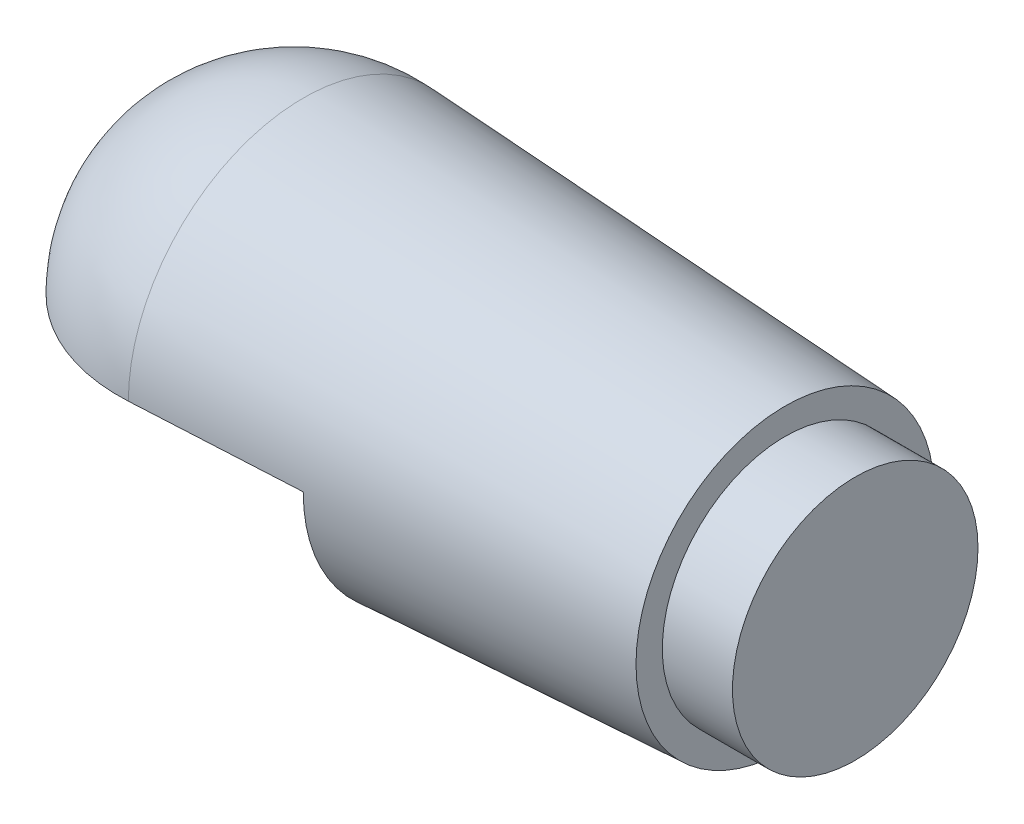
ISO-10303-21;
HEADER;
FILE_DESCRIPTION(('STEP AP214'),'2;1');
FILE_NAME('part.step','',(''),(''),'','','');
FILE_SCHEMA(('AUTOMOTIVE_DESIGN { 1 0 10303 214 1 1 1 1 }'));
ENDSEC;
DATA;
#1=APPLICATION_CONTEXT('core data for automotive mechanical design processes');
#2=APPLICATION_PROTOCOL_DEFINITION('international standard','automotive_design',2000,#1);
#3=PRODUCT_CONTEXT('',#1,'mechanical');
#4=PRODUCT('Part','Part','',(#3));
#5=PRODUCT_RELATED_PRODUCT_CATEGORY('part','',(#4));
#6=PRODUCT_DEFINITION_FORMATION('','',#4);
#7=PRODUCT_DEFINITION_CONTEXT('part definition',#1,'design');
#8=PRODUCT_DEFINITION('design','',#6,#7);
#9=PRODUCT_DEFINITION_SHAPE('','',#8);
#10=(LENGTH_UNIT() NAMED_UNIT(*) SI_UNIT(.MILLI.,.METRE.));
#11=(NAMED_UNIT(*) PLANE_ANGLE_UNIT() SI_UNIT($,.RADIAN.));
#12=(NAMED_UNIT(*) SI_UNIT($,.STERADIAN.) SOLID_ANGLE_UNIT());
#13=UNCERTAINTY_MEASURE_WITH_UNIT(LENGTH_MEASURE(1.E-05),#10,'distance_accuracy_value','');
#14=(GEOMETRIC_REPRESENTATION_CONTEXT(3) GLOBAL_UNCERTAINTY_ASSIGNED_CONTEXT((#13)) GLOBAL_UNIT_ASSIGNED_CONTEXT((#10,
#11,#12)) REPRESENTATION_CONTEXT('',''));
#15=CARTESIAN_POINT('',(0.,0.,0.));
#16=DIRECTION('',(0.,0.,1.));
#17=DIRECTION('',(1.,0.,0.));
#18=AXIS2_PLACEMENT_3D('',#15,#16,#17);
#19=CARTESIAN_POINT('',(0.,0.,0.));
#20=DIRECTION('',(-1.,0.,0.));
#21=DIRECTION('',(0.,0.,1.));
#22=AXIS2_PLACEMENT_3D('',#19,#20,#21);
#23=CONICAL_SURFACE('',#22,42.5,0.0540408983745297);
#24=CARTESIAN_POINT('',(0.,0.,0.));
#25=DIRECTION('',(-1.,0.,0.));
#26=DIRECTION('',(0.,0.,1.));
#27=AXIS2_PLACEMENT_3D('',#24,#25,#26);
#28=CIRCLE('',#27,42.5);
#29=CARTESIAN_POINT('',(0.,0.,42.5));
#30=VERTEX_POINT('',#29);
#31=EDGE_CURVE('E64',#30,#30,#28,.T.);
#32=ORIENTED_EDGE('',*,*,#31,.T.);
#33=EDGE_LOOP('',(#32));
#34=FACE_BOUND('',#33,.T.);
#35=DIRECTION('',(-0.998540145985401,0.,0.0540145985401461));
#36=VECTOR('',#35,1.);
#37=CARTESIAN_POINT('',(785.675675675674,0.,0.));
#38=LINE('',#37,#36);
#39=CARTESIAN_POINT('',(-90.,0.,47.3684210526316));
#40=VERTEX_POINT('',#39);
#41=CARTESIAN_POINT('',(-137.299270072993,0.,49.9270072992701));
#42=VERTEX_POINT('',#41);
#43=EDGE_CURVE('E53',#40,#42,#38,.T.);
#44=ORIENTED_EDGE('',*,*,#43,.F.);
#45=CARTESIAN_POINT('',(-90.,0.,0.));
#46=DIRECTION('',(1.,0.,0.));
#47=DIRECTION('',(0.,0.,-1.));
#48=AXIS2_PLACEMENT_3D('',#45,#46,#47);
#49=CIRCLE('',#48,47.3684210526316);
#50=CARTESIAN_POINT('',(-90.,0.,-47.3684210526316));
#51=VERTEX_POINT('',#50);
#52=EDGE_CURVE('E36',#40,#51,#49,.T.);
#53=ORIENTED_EDGE('',*,*,#52,.T.);
#54=DIRECTION('',(0.998540145985401,0.,0.0540145985401461));
#55=VECTOR('',#54,1.);
#56=CARTESIAN_POINT('',(785.675675675674,0.,0.));
#57=LINE('',#56,#55);
#58=CARTESIAN_POINT('',(-137.299270072993,0.,-49.9270072992701));
#59=VERTEX_POINT('',#58);
#60=EDGE_CURVE('E66',#59,#51,#57,.T.);
#61=ORIENTED_EDGE('',*,*,#60,.F.);
#62=CARTESIAN_POINT('',(-137.299270072993,0.,0.));
#63=DIRECTION('',(-1.,0.,0.));
#64=DIRECTION('',(0.,0.,1.));
#65=AXIS2_PLACEMENT_3D('',#62,#63,#64);
#66=CIRCLE('',#65,49.9270072992701);
#67=EDGE_CURVE('E72',#42,#59,#66,.T.);
#68=ORIENTED_EDGE('',*,*,#67,.F.);
#69=EDGE_LOOP('',(#44,#53,#61,#68));
#70=FACE_BOUND('',#69,.T.);
#71=ADVANCED_FACE('F32',(#34,#70),#23,.T.);
#72=CARTESIAN_POINT('',(-140.,0.,0.));
#73=DIRECTION('',(-1.,0.,0.));
#74=DIRECTION('',(0.,0.,-1.));
#75=AXIS2_PLACEMENT_3D('',#72,#73,#74);
#76=SPHERICAL_SURFACE('',#75,50.);
#77=ORIENTED_EDGE('',*,*,#67,.T.);
#78=CARTESIAN_POINT('',(-140.,0.,0.));
#79=DIRECTION('',(0.,-1.,0.));
#80=DIRECTION('',(0.,0.,-1.));
#81=AXIS2_PLACEMENT_3D('',#78,#79,#80);
#82=CIRCLE('',#81,50.);
#83=EDGE_CURVE('E48',#42,#59,#82,.T.);
#84=ORIENTED_EDGE('',*,*,#83,.F.);
#85=EDGE_LOOP('',(#77,#84));
#86=FACE_BOUND('',#85,.T.);
#87=ADVANCED_FACE('F97',(#86),#76,.T.);
#88=CARTESIAN_POINT('',(0.,0.,0.));
#89=DIRECTION('',(-1.,0.,0.));
#90=DIRECTION('',(0.,0.,1.));
#91=AXIS2_PLACEMENT_3D('',#88,#89,#90);
#92=PLANE('',#91);
#93=CARTESIAN_POINT('',(0.,0.,0.));
#94=DIRECTION('',(1.,0.,0.));
#95=DIRECTION('',(0.,0.,-1.));
#96=AXIS2_PLACEMENT_3D('',#93,#94,#95);
#97=CIRCLE('',#96,35.);
#98=CARTESIAN_POINT('',(0.,0.,-35.));
#99=VERTEX_POINT('',#98);
#100=EDGE_CURVE('E11',#99,#99,#97,.T.);
#101=ORIENTED_EDGE('',*,*,#100,.F.);
#102=EDGE_LOOP('',(#101));
#103=FACE_BOUND('',#102,.T.);
#104=ORIENTED_EDGE('',*,*,#31,.F.);
#105=EDGE_LOOP('',(#104));
#106=FACE_BOUND('',#105,.T.);
#107=ADVANCED_FACE('F34',(#103,#106),#92,.F.);
#108=CARTESIAN_POINT('',(-90.,-62.,50.));
#109=DIRECTION('',(1.,0.,0.));
#110=DIRECTION('',(0.,0.,-1.));
#111=AXIS2_PLACEMENT_3D('',#108,#109,#110);
#112=PLANE('',#111);
#113=DIRECTION('',(0.,0.,-1.));
#114=VECTOR('',#113,1.);
#115=CARTESIAN_POINT('',(-90.,0.,50.));
#116=LINE('',#115,#114);
#117=EDGE_CURVE('E62',#40,#51,#116,.T.);
#118=ORIENTED_EDGE('',*,*,#117,.T.);
#119=ORIENTED_EDGE('',*,*,#52,.F.);
#120=EDGE_LOOP('',(#118,#119));
#121=FACE_BOUND('',#120,.T.);
#122=ADVANCED_FACE('F61',(#121),#112,.F.);
#123=CARTESIAN_POINT('',(0.,0.,0.));
#124=DIRECTION('',(0.,-1.,0.));
#125=DIRECTION('',(0.,0.,-1.));
#126=AXIS2_PLACEMENT_3D('',#123,#124,#125);
#127=PLANE('',#126);
#128=CARTESIAN_POINT('',(-140.,0.,0.));
#129=DIRECTION('',(0.,-1.,0.));
#130=DIRECTION('',(0.,0.,-1.));
#131=AXIS2_PLACEMENT_3D('',#128,#129,#130);
#132=CIRCLE('',#131,35.);
#133=CARTESIAN_POINT('',(-140.,0.,-35.));
#134=VERTEX_POINT('',#133);
#135=EDGE_CURVE('E67',#134,#134,#132,.F.);
#136=ORIENTED_EDGE('',*,*,#135,.T.);
#137=EDGE_LOOP('',(#136));
#138=FACE_BOUND('',#137,.T.);
#139=ORIENTED_EDGE('',*,*,#43,.T.);
#140=ORIENTED_EDGE('',*,*,#83,.T.);
#141=ORIENTED_EDGE('',*,*,#60,.T.);
#142=ORIENTED_EDGE('',*,*,#117,.F.);
#143=EDGE_LOOP('',(#139,#140,#141,#142));
#144=FACE_BOUND('',#143,.T.);
#145=ADVANCED_FACE('F65',(#138,#144),#127,.T.);
#146=CARTESIAN_POINT('',(-140.,0.,0.));
#147=DIRECTION('',(-1.,0.,0.));
#148=DIRECTION('',(0.,0.,1.));
#149=AXIS2_PLACEMENT_3D('',#146,#147,#148);
#150=SPHERICAL_SURFACE('',#149,35.);
#151=CARTESIAN_POINT('',(-140.,0.,0.));
#152=DIRECTION('',(0.,-1.,0.));
#153=DIRECTION('',(0.,0.,-1.));
#154=AXIS2_PLACEMENT_3D('',#151,#152,#153);
#155=SPHERICAL_SURFACE('',#154,35.);
#156=ORIENTED_EDGE('',*,*,#135,.F.);
#157=EDGE_LOOP('',(#156));
#158=FACE_BOUND('',#157,.T.);
#159=ADVANCED_FACE('F91',(#158),#155,.F.);
#160=CARTESIAN_POINT('',(20.,0.,0.));
#161=DIRECTION('',(-1.,0.,0.));
#162=DIRECTION('',(0.,0.,1.));
#163=AXIS2_PLACEMENT_3D('',#160,#161,#162);
#164=CYLINDRICAL_SURFACE('',#163,35.);
#165=CARTESIAN_POINT('',(20.,0.,0.));
#166=DIRECTION('',(1.,0.,0.));
#167=DIRECTION('',(0.,0.,-1.));
#168=AXIS2_PLACEMENT_3D('',#165,#166,#167);
#169=CIRCLE('',#168,35.);
#170=CARTESIAN_POINT('',(20.,0.,-35.));
#171=VERTEX_POINT('',#170);
#172=EDGE_CURVE('E68',#171,#171,#169,.T.);
#173=ORIENTED_EDGE('',*,*,#172,.F.);
#174=EDGE_LOOP('',(#173));
#175=FACE_BOUND('',#174,.T.);
#176=ORIENTED_EDGE('',*,*,#100,.T.);
#177=EDGE_LOOP('',(#176));
#178=FACE_BOUND('',#177,.T.);
#179=ADVANCED_FACE('F88',(#175,#178),#164,.T.);
#180=CARTESIAN_POINT('',(20.,0.,0.));
#181=DIRECTION('',(1.,0.,0.));
#182=DIRECTION('',(0.,0.,-1.));
#183=AXIS2_PLACEMENT_3D('',#180,#181,#182);
#184=PLANE('',#183);
#185=ORIENTED_EDGE('',*,*,#172,.T.);
#186=EDGE_LOOP('',(#185));
#187=FACE_BOUND('',#186,.T.);
#188=ADVANCED_FACE('F86',(#187),#184,.T.);
#189=CLOSED_SHELL('',(#71,#87,#107,#122,#145,#159,#179,#188));
#190=MANIFOLD_SOLID_BREP('B2',#189);
#191=ADVANCED_BREP_SHAPE_REPRESENTATION('',(#18,#190),#14);
#192=SHAPE_DEFINITION_REPRESENTATION(#9,#191);
ENDSEC;
END-ISO-10303-21;
